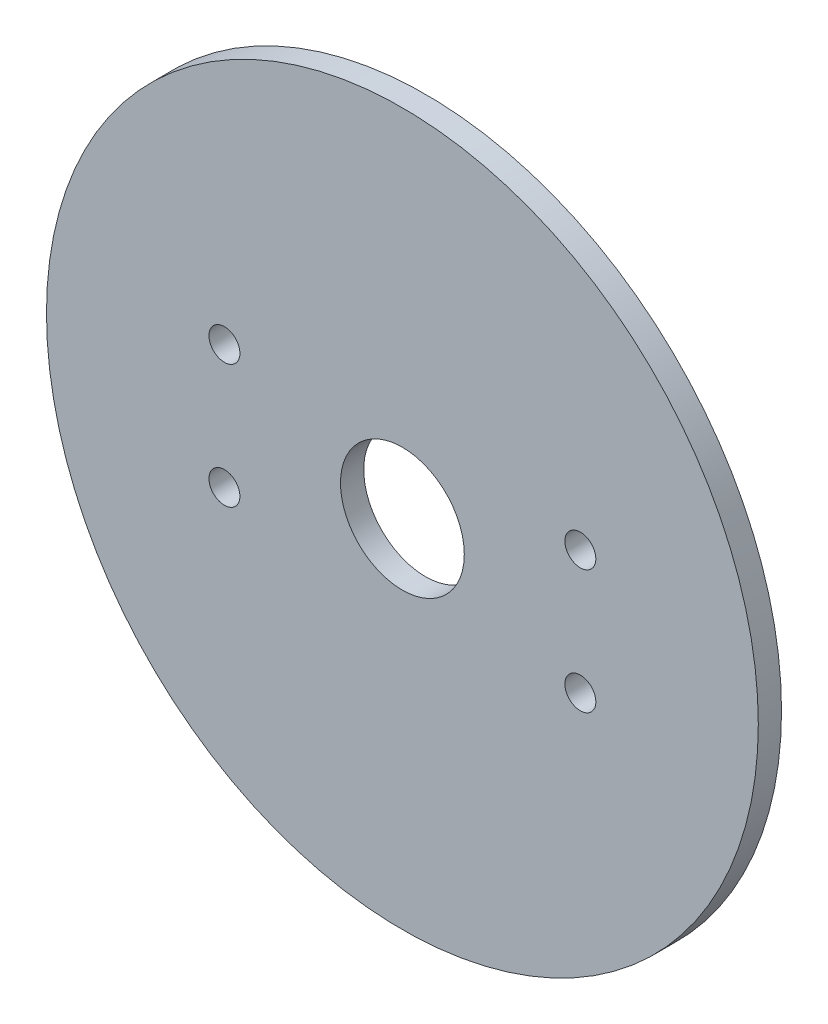
ISO-10303-21;
HEADER;
FILE_DESCRIPTION(('STEP AP214'),'2;1');
FILE_NAME('part.step','',(''),(''),'','','');
FILE_SCHEMA(('AUTOMOTIVE_DESIGN { 1 0 10303 214 1 1 1 1 }'));
ENDSEC;
DATA;
#1=APPLICATION_CONTEXT('core data for automotive mechanical design processes');
#2=APPLICATION_PROTOCOL_DEFINITION('international standard','automotive_design',2000,#1);
#3=PRODUCT_CONTEXT('',#1,'mechanical');
#4=PRODUCT('Part','Part','',(#3));
#5=PRODUCT_RELATED_PRODUCT_CATEGORY('part','',(#4));
#6=PRODUCT_DEFINITION_FORMATION('','',#4);
#7=PRODUCT_DEFINITION_CONTEXT('part definition',#1,'design');
#8=PRODUCT_DEFINITION('design','',#6,#7);
#9=PRODUCT_DEFINITION_SHAPE('','',#8);
#10=(LENGTH_UNIT() NAMED_UNIT(*) SI_UNIT(.MILLI.,.METRE.));
#11=(NAMED_UNIT(*) PLANE_ANGLE_UNIT() SI_UNIT($,.RADIAN.));
#12=(NAMED_UNIT(*) SI_UNIT($,.STERADIAN.) SOLID_ANGLE_UNIT());
#13=UNCERTAINTY_MEASURE_WITH_UNIT(LENGTH_MEASURE(1.E-05),#10,'distance_accuracy_value','');
#14=(GEOMETRIC_REPRESENTATION_CONTEXT(3) GLOBAL_UNCERTAINTY_ASSIGNED_CONTEXT((#13)) GLOBAL_UNIT_ASSIGNED_CONTEXT((#10,
#11,#12)) REPRESENTATION_CONTEXT('',''));
#15=CARTESIAN_POINT('',(0.,0.,0.));
#16=DIRECTION('',(0.,0.,1.));
#17=DIRECTION('',(1.,0.,0.));
#18=AXIS2_PLACEMENT_3D('',#15,#16,#17);
#19=CARTESIAN_POINT('',(0.,0.,3.));
#20=DIRECTION('',(0.,0.,1.));
#21=DIRECTION('',(1.,0.,0.));
#22=AXIS2_PLACEMENT_3D('',#19,#20,#21);
#23=PLANE('',#22);
#24=CARTESIAN_POINT('',(-23.,-8.,3.));
#25=DIRECTION('',(0.,0.,-1.));
#26=DIRECTION('',(-1.,0.,0.));
#27=AXIS2_PLACEMENT_3D('',#24,#25,#26);
#28=CIRCLE('',#27,2.);
#29=CARTESIAN_POINT('',(-25.,-8.,3.));
#30=VERTEX_POINT('',#29);
#31=EDGE_CURVE('E52',#30,#30,#28,.T.);
#32=ORIENTED_EDGE('',*,*,#31,.T.);
#33=EDGE_LOOP('',(#32));
#34=FACE_BOUND('',#33,.T.);
#35=CARTESIAN_POINT('',(-23.,8.,3.));
#36=DIRECTION('',(0.,0.,1.));
#37=DIRECTION('',(1.,0.,0.));
#38=AXIS2_PLACEMENT_3D('',#35,#36,#37);
#39=CIRCLE('',#38,2.);
#40=CARTESIAN_POINT('',(-21.,8.,3.));
#41=VERTEX_POINT('',#40);
#42=EDGE_CURVE('E49',#41,#41,#39,.T.);
#43=ORIENTED_EDGE('',*,*,#42,.F.);
#44=EDGE_LOOP('',(#43));
#45=FACE_BOUND('',#44,.T.);
#46=CARTESIAN_POINT('',(0.,0.,3.));
#47=DIRECTION('',(0.,0.,1.));
#48=DIRECTION('',(1.,0.,0.));
#49=AXIS2_PLACEMENT_3D('',#46,#47,#48);
#50=CIRCLE('',#49,8.);
#51=CARTESIAN_POINT('',(8.,0.,3.));
#52=VERTEX_POINT('',#51);
#53=EDGE_CURVE('E43',#52,#52,#50,.T.);
#54=ORIENTED_EDGE('',*,*,#53,.F.);
#55=EDGE_LOOP('',(#54));
#56=FACE_BOUND('',#55,.T.);
#57=CARTESIAN_POINT('',(0.,0.,3.));
#58=DIRECTION('',(0.,0.,1.));
#59=DIRECTION('',(1.,0.,0.));
#60=AXIS2_PLACEMENT_3D('',#57,#58,#59);
#61=CIRCLE('',#60,46.);
#62=CARTESIAN_POINT('',(46.,0.,3.));
#63=VERTEX_POINT('',#62);
#64=EDGE_CURVE('E10',#63,#63,#61,.T.);
#65=ORIENTED_EDGE('',*,*,#64,.T.);
#66=EDGE_LOOP('',(#65));
#67=FACE_BOUND('',#66,.T.);
#68=CARTESIAN_POINT('',(23.,-8.,3.));
#69=DIRECTION('',(0.,0.,1.));
#70=DIRECTION('',(1.,0.,0.));
#71=AXIS2_PLACEMENT_3D('',#68,#69,#70);
#72=CIRCLE('',#71,2.);
#73=CARTESIAN_POINT('',(25.,-8.,3.));
#74=VERTEX_POINT('',#73);
#75=EDGE_CURVE('E64',#74,#74,#72,.T.);
#76=ORIENTED_EDGE('',*,*,#75,.F.);
#77=EDGE_LOOP('',(#76));
#78=FACE_BOUND('',#77,.T.);
#79=CARTESIAN_POINT('',(23.,8.,3.));
#80=DIRECTION('',(0.,0.,-1.));
#81=DIRECTION('',(-1.,0.,0.));
#82=AXIS2_PLACEMENT_3D('',#79,#80,#81);
#83=CIRCLE('',#82,2.);
#84=CARTESIAN_POINT('',(21.,8.,3.));
#85=VERTEX_POINT('',#84);
#86=EDGE_CURVE('E58',#85,#85,#83,.T.);
#87=ORIENTED_EDGE('',*,*,#86,.T.);
#88=EDGE_LOOP('',(#87));
#89=FACE_BOUND('',#88,.T.);
#90=ADVANCED_FACE('F30',(#34,#45,#56,#67,#78,#89),#23,.T.);
#91=CARTESIAN_POINT('',(0.,0.,0.));
#92=DIRECTION('',(0.,0.,1.));
#93=DIRECTION('',(1.,0.,0.));
#94=AXIS2_PLACEMENT_3D('',#91,#92,#93);
#95=PLANE('',#94);
#96=CARTESIAN_POINT('',(23.,-8.,0.));
#97=DIRECTION('',(0.,0.,1.));
#98=DIRECTION('',(1.,0.,0.));
#99=AXIS2_PLACEMENT_3D('',#96,#97,#98);
#100=CIRCLE('',#99,2.);
#101=CARTESIAN_POINT('',(25.,-8.,0.));
#102=VERTEX_POINT('',#101);
#103=EDGE_CURVE('E61',#102,#102,#100,.T.);
#104=ORIENTED_EDGE('',*,*,#103,.T.);
#105=EDGE_LOOP('',(#104));
#106=FACE_BOUND('',#105,.T.);
#107=CARTESIAN_POINT('',(-23.,8.,0.));
#108=DIRECTION('',(0.,0.,1.));
#109=DIRECTION('',(1.,0.,0.));
#110=AXIS2_PLACEMENT_3D('',#107,#108,#109);
#111=CIRCLE('',#110,2.);
#112=CARTESIAN_POINT('',(-21.,8.,0.));
#113=VERTEX_POINT('',#112);
#114=EDGE_CURVE('E46',#113,#113,#111,.T.);
#115=ORIENTED_EDGE('',*,*,#114,.T.);
#116=EDGE_LOOP('',(#115));
#117=FACE_BOUND('',#116,.T.);
#118=CARTESIAN_POINT('',(0.,0.,0.));
#119=DIRECTION('',(0.,0.,1.));
#120=DIRECTION('',(1.,0.,0.));
#121=AXIS2_PLACEMENT_3D('',#118,#119,#120);
#122=CIRCLE('',#121,8.);
#123=CARTESIAN_POINT('',(8.,0.,0.));
#124=VERTEX_POINT('',#123);
#125=EDGE_CURVE('E41',#124,#124,#122,.T.);
#126=ORIENTED_EDGE('',*,*,#125,.T.);
#127=EDGE_LOOP('',(#126));
#128=FACE_BOUND('',#127,.T.);
#129=CARTESIAN_POINT('',(0.,0.,0.));
#130=DIRECTION('',(0.,0.,1.));
#131=DIRECTION('',(1.,0.,0.));
#132=AXIS2_PLACEMENT_3D('',#129,#130,#131);
#133=CIRCLE('',#132,46.);
#134=CARTESIAN_POINT('',(46.,0.,0.));
#135=VERTEX_POINT('',#134);
#136=EDGE_CURVE('E34',#135,#135,#133,.T.);
#137=ORIENTED_EDGE('',*,*,#136,.F.);
#138=EDGE_LOOP('',(#137));
#139=FACE_BOUND('',#138,.T.);
#140=CARTESIAN_POINT('',(-23.,-8.,0.));
#141=DIRECTION('',(0.,0.,-1.));
#142=DIRECTION('',(-1.,0.,0.));
#143=AXIS2_PLACEMENT_3D('',#140,#141,#142);
#144=CIRCLE('',#143,2.);
#145=CARTESIAN_POINT('',(-25.,-8.,0.));
#146=VERTEX_POINT('',#145);
#147=EDGE_CURVE('E67',#146,#146,#144,.T.);
#148=ORIENTED_EDGE('',*,*,#147,.F.);
#149=EDGE_LOOP('',(#148));
#150=FACE_BOUND('',#149,.T.);
#151=CARTESIAN_POINT('',(23.,8.,0.));
#152=DIRECTION('',(0.,0.,-1.));
#153=DIRECTION('',(-1.,0.,0.));
#154=AXIS2_PLACEMENT_3D('',#151,#152,#153);
#155=CIRCLE('',#154,2.);
#156=CARTESIAN_POINT('',(21.,8.,0.));
#157=VERTEX_POINT('',#156);
#158=EDGE_CURVE('E55',#157,#157,#155,.T.);
#159=ORIENTED_EDGE('',*,*,#158,.F.);
#160=EDGE_LOOP('',(#159));
#161=FACE_BOUND('',#160,.T.);
#162=ADVANCED_FACE('F92',(#106,#117,#128,#139,#150,#161),#95,.F.);
#163=CARTESIAN_POINT('',(0.,0.,3.));
#164=DIRECTION('',(0.,0.,-1.));
#165=DIRECTION('',(-1.,0.,0.));
#166=AXIS2_PLACEMENT_3D('',#163,#164,#165);
#167=CYLINDRICAL_SURFACE('',#166,46.);
#168=ORIENTED_EDGE('',*,*,#64,.F.);
#169=EDGE_LOOP('',(#168));
#170=FACE_BOUND('',#169,.T.);
#171=ORIENTED_EDGE('',*,*,#136,.T.);
#172=EDGE_LOOP('',(#171));
#173=FACE_BOUND('',#172,.T.);
#174=ADVANCED_FACE('F32',(#170,#173),#167,.T.);
#175=CARTESIAN_POINT('',(0.,0.,0.));
#176=DIRECTION('',(0.,0.,1.));
#177=DIRECTION('',(1.,0.,0.));
#178=AXIS2_PLACEMENT_3D('',#175,#176,#177);
#179=CYLINDRICAL_SURFACE('',#178,8.);
#180=ORIENTED_EDGE('',*,*,#125,.F.);
#181=EDGE_LOOP('',(#180));
#182=FACE_BOUND('',#181,.T.);
#183=ORIENTED_EDGE('',*,*,#53,.T.);
#184=EDGE_LOOP('',(#183));
#185=FACE_BOUND('',#184,.T.);
#186=ADVANCED_FACE('F88',(#182,#185),#179,.F.);
#187=CARTESIAN_POINT('',(-23.,8.,0.));
#188=DIRECTION('',(0.,0.,1.));
#189=DIRECTION('',(1.,0.,0.));
#190=AXIS2_PLACEMENT_3D('',#187,#188,#189);
#191=CYLINDRICAL_SURFACE('',#190,2.);
#192=ORIENTED_EDGE('',*,*,#114,.F.);
#193=EDGE_LOOP('',(#192));
#194=FACE_BOUND('',#193,.T.);
#195=ORIENTED_EDGE('',*,*,#42,.T.);
#196=EDGE_LOOP('',(#195));
#197=FACE_BOUND('',#196,.T.);
#198=ADVANCED_FACE('F78',(#194,#197),#191,.F.);
#199=CARTESIAN_POINT('',(-23.,-8.,0.));
#200=DIRECTION('',(0.,0.,1.));
#201=DIRECTION('',(1.,0.,0.));
#202=AXIS2_PLACEMENT_3D('',#199,#200,#201);
#203=CYLINDRICAL_SURFACE('',#202,2.);
#204=ORIENTED_EDGE('',*,*,#147,.T.);
#205=EDGE_LOOP('',(#204));
#206=FACE_BOUND('',#205,.T.);
#207=ORIENTED_EDGE('',*,*,#31,.F.);
#208=EDGE_LOOP('',(#207));
#209=FACE_BOUND('',#208,.T.);
#210=ADVANCED_FACE('F75',(#206,#209),#203,.F.);
#211=CARTESIAN_POINT('',(23.,-8.,0.));
#212=DIRECTION('',(0.,0.,1.));
#213=DIRECTION('',(1.,0.,0.));
#214=AXIS2_PLACEMENT_3D('',#211,#212,#213);
#215=CYLINDRICAL_SURFACE('',#214,2.);
#216=ORIENTED_EDGE('',*,*,#103,.F.);
#217=EDGE_LOOP('',(#216));
#218=FACE_BOUND('',#217,.T.);
#219=ORIENTED_EDGE('',*,*,#75,.T.);
#220=EDGE_LOOP('',(#219));
#221=FACE_BOUND('',#220,.T.);
#222=ADVANCED_FACE('F77',(#218,#221),#215,.F.);
#223=CARTESIAN_POINT('',(23.,8.,0.));
#224=DIRECTION('',(0.,0.,1.));
#225=DIRECTION('',(1.,0.,0.));
#226=AXIS2_PLACEMENT_3D('',#223,#224,#225);
#227=CYLINDRICAL_SURFACE('',#226,2.);
#228=ORIENTED_EDGE('',*,*,#158,.T.);
#229=EDGE_LOOP('',(#228));
#230=FACE_BOUND('',#229,.T.);
#231=ORIENTED_EDGE('',*,*,#86,.F.);
#232=EDGE_LOOP('',(#231));
#233=FACE_BOUND('',#232,.T.);
#234=ADVANCED_FACE('F85',(#230,#233),#227,.F.);
#235=CLOSED_SHELL('',(#90,#162,#174,#186,#198,#210,#222,#234));
#236=MANIFOLD_SOLID_BREP('B2',#235);
#237=ADVANCED_BREP_SHAPE_REPRESENTATION('',(#18,#236),#14);
#238=SHAPE_DEFINITION_REPRESENTATION(#9,#237);
ENDSEC;
END-ISO-10303-21;
